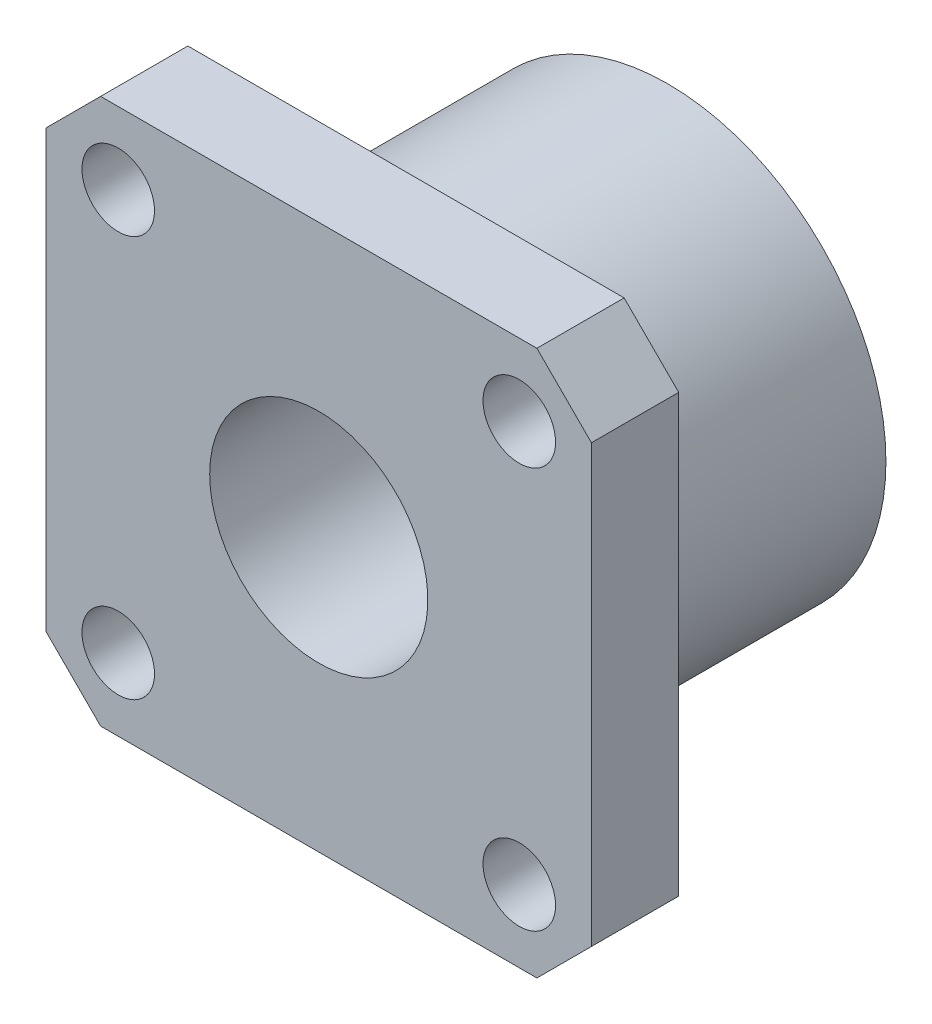
ISO-10303-21;
HEADER;
FILE_DESCRIPTION(('STEP AP214'),'2;1');
FILE_NAME('part.step','',(''),(''),'','','');
FILE_SCHEMA(('AUTOMOTIVE_DESIGN { 1 0 10303 214 1 1 1 1 }'));
ENDSEC;
DATA;
#1=APPLICATION_CONTEXT('core data for automotive mechanical design processes');
#2=APPLICATION_PROTOCOL_DEFINITION('international standard','automotive_design',2000,#1);
#3=PRODUCT_CONTEXT('',#1,'mechanical');
#4=PRODUCT('Part','Part','',(#3));
#5=PRODUCT_RELATED_PRODUCT_CATEGORY('part','',(#4));
#6=PRODUCT_DEFINITION_FORMATION('','',#4);
#7=PRODUCT_DEFINITION_CONTEXT('part definition',#1,'design');
#8=PRODUCT_DEFINITION('design','',#6,#7);
#9=PRODUCT_DEFINITION_SHAPE('','',#8);
#10=(LENGTH_UNIT() NAMED_UNIT(*) SI_UNIT(.MILLI.,.METRE.));
#11=(NAMED_UNIT(*) PLANE_ANGLE_UNIT() SI_UNIT($,.RADIAN.));
#12=(NAMED_UNIT(*) SI_UNIT($,.STERADIAN.) SOLID_ANGLE_UNIT());
#13=UNCERTAINTY_MEASURE_WITH_UNIT(LENGTH_MEASURE(1.E-05),#10,'distance_accuracy_value','');
#14=(GEOMETRIC_REPRESENTATION_CONTEXT(3) GLOBAL_UNCERTAINTY_ASSIGNED_CONTEXT((#13)) GLOBAL_UNIT_ASSIGNED_CONTEXT((#10,
#11,#12)) REPRESENTATION_CONTEXT('',''));
#15=CARTESIAN_POINT('',(0.,0.,0.));
#16=DIRECTION('',(0.,0.,1.));
#17=DIRECTION('',(1.,0.,0.));
#18=AXIS2_PLACEMENT_3D('',#15,#16,#17);
#19=CARTESIAN_POINT('',(0.,0.,8.));
#20=DIRECTION('',(0.,0.,1.));
#21=DIRECTION('',(1.,0.,0.));
#22=AXIS2_PLACEMENT_3D('',#19,#20,#21);
#23=PLANE('',#22);
#24=CARTESIAN_POINT('',(0.,0.,8.));
#25=DIRECTION('',(0.,0.,-1.));
#26=DIRECTION('',(-1.,0.,0.));
#27=AXIS2_PLACEMENT_3D('',#24,#25,#26);
#28=CIRCLE('',#27,10.);
#29=CARTESIAN_POINT('',(-10.,0.,8.));
#30=VERTEX_POINT('',#29);
#31=EDGE_CURVE('E373',#30,#30,#28,.T.);
#32=ORIENTED_EDGE('',*,*,#31,.T.);
#33=EDGE_LOOP('',(#32));
#34=FACE_BOUND('',#33,.T.);
#35=CARTESIAN_POINT('',(18.3847763108513,-18.3847763108492,8.));
#36=DIRECTION('',(0.,0.,1.));
#37=DIRECTION('',(1.,0.,0.));
#38=AXIS2_PLACEMENT_3D('',#35,#36,#37);
#39=CIRCLE('',#38,3.32500000000144);
#40=CARTESIAN_POINT('',(21.7097763108527,-18.3847763108492,8.));
#41=VERTEX_POINT('',#40);
#42=EDGE_CURVE('E203',#41,#41,#39,.T.);
#43=ORIENTED_EDGE('',*,*,#42,.F.);
#44=EDGE_LOOP('',(#43));
#45=FACE_BOUND('',#44,.T.);
#46=CARTESIAN_POINT('',(-18.3847763108502,18.3847763108502,8.));
#47=DIRECTION('',(0.,0.,1.));
#48=DIRECTION('',(1.,0.,0.));
#49=AXIS2_PLACEMENT_3D('',#46,#47,#48);
#50=CIRCLE('',#49,3.325);
#51=CARTESIAN_POINT('',(-15.0597763108502,18.3847763108502,8.));
#52=VERTEX_POINT('',#51);
#53=EDGE_CURVE('E141',#52,#52,#50,.T.);
#54=ORIENTED_EDGE('',*,*,#53,.F.);
#55=EDGE_LOOP('',(#54));
#56=FACE_BOUND('',#55,.T.);
#57=DIRECTION('',(0.,-1.,0.));
#58=VECTOR('',#57,1.);
#59=CARTESIAN_POINT('',(-25.,-25.,8.));
#60=LINE('',#59,#58);
#61=CARTESIAN_POINT('',(-25.,20.,8.));
#62=VERTEX_POINT('',#61);
#63=CARTESIAN_POINT('',(-25.,-20.,8.));
#64=VERTEX_POINT('',#63);
#65=EDGE_CURVE('E146',#62,#64,#60,.T.);
#66=ORIENTED_EDGE('',*,*,#65,.T.);
#67=DIRECTION('',(-0.707106781186546,0.707106781186549,0.));
#68=VECTOR('',#67,1.);
#69=CARTESIAN_POINT('',(-22.5000000000001,-22.4999999999999,8.));
#70=LINE('',#69,#68);
#71=CARTESIAN_POINT('',(-20.,-25.,8.));
#72=VERTEX_POINT('',#71);
#73=EDGE_CURVE('E161',#64,#72,#70,.F.);
#74=ORIENTED_EDGE('',*,*,#73,.T.);
#75=DIRECTION('',(1.,0.,0.));
#76=VECTOR('',#75,1.);
#77=CARTESIAN_POINT('',(25.,-25.,8.));
#78=LINE('',#77,#76);
#79=CARTESIAN_POINT('',(20.,-25.,8.));
#80=VERTEX_POINT('',#79);
#81=EDGE_CURVE('E128',#72,#80,#78,.T.);
#82=ORIENTED_EDGE('',*,*,#81,.T.);
#83=DIRECTION('',(-0.707106781186549,-0.707106781186546,0.));
#84=VECTOR('',#83,1.);
#85=CARTESIAN_POINT('',(22.4999999999999,-22.5,8.));
#86=LINE('',#85,#84);
#87=CARTESIAN_POINT('',(25.,-20.,8.));
#88=VERTEX_POINT('',#87);
#89=EDGE_CURVE('E159',#80,#88,#86,.F.);
#90=ORIENTED_EDGE('',*,*,#89,.T.);
#91=DIRECTION('',(0.,1.,0.));
#92=VECTOR('',#91,1.);
#93=CARTESIAN_POINT('',(25.,-25.,8.));
#94=LINE('',#93,#92);
#95=CARTESIAN_POINT('',(25.,20.,8.));
#96=VERTEX_POINT('',#95);
#97=EDGE_CURVE('E181',#88,#96,#94,.T.);
#98=ORIENTED_EDGE('',*,*,#97,.T.);
#99=DIRECTION('',(0.707106781186546,-0.707106781186549,0.));
#100=VECTOR('',#99,1.);
#101=CARTESIAN_POINT('',(22.5,22.5,8.));
#102=LINE('',#101,#100);
#103=CARTESIAN_POINT('',(20.,25.,8.));
#104=VERTEX_POINT('',#103);
#105=EDGE_CURVE('E63',#96,#104,#102,.F.);
#106=ORIENTED_EDGE('',*,*,#105,.T.);
#107=DIRECTION('',(-1.,0.,0.));
#108=VECTOR('',#107,1.);
#109=CARTESIAN_POINT('',(25.,25.,8.));
#110=LINE('',#109,#108);
#111=CARTESIAN_POINT('',(-20.,25.,8.));
#112=VERTEX_POINT('',#111);
#113=EDGE_CURVE('E147',#104,#112,#110,.T.);
#114=ORIENTED_EDGE('',*,*,#113,.T.);
#115=DIRECTION('',(0.707106781186549,0.707106781186546,0.));
#116=VECTOR('',#115,1.);
#117=CARTESIAN_POINT('',(-22.4999999999999,22.5000000000001,8.));
#118=LINE('',#117,#116);
#119=EDGE_CURVE('E156',#112,#62,#118,.F.);
#120=ORIENTED_EDGE('',*,*,#119,.T.);
#121=EDGE_LOOP('',(#66,#74,#82,#90,#98,#106,#114,#120));
#122=FACE_BOUND('',#121,.T.);
#123=CARTESIAN_POINT('',(18.3847763108502,18.3847763108513,8.));
#124=DIRECTION('',(0.,0.,1.));
#125=DIRECTION('',(1.,0.,0.));
#126=AXIS2_PLACEMENT_3D('',#123,#124,#125);
#127=CIRCLE('',#126,3.32500000000105);
#128=CARTESIAN_POINT('',(21.7097763108513,18.3847763108513,8.));
#129=VERTEX_POINT('',#128);
#130=EDGE_CURVE('E194',#129,#129,#127,.T.);
#131=ORIENTED_EDGE('',*,*,#130,.F.);
#132=EDGE_LOOP('',(#131));
#133=FACE_BOUND('',#132,.T.);
#134=CARTESIAN_POINT('',(-18.3847763108492,-18.3847763108503,8.));
#135=DIRECTION('',(0.,0.,1.));
#136=DIRECTION('',(1.,0.,0.));
#137=AXIS2_PLACEMENT_3D('',#134,#135,#136);
#138=CIRCLE('',#137,3.32500000000055);
#139=CARTESIAN_POINT('',(-15.0597763108487,-18.3847763108503,8.));
#140=VERTEX_POINT('',#139);
#141=EDGE_CURVE('E197',#140,#140,#138,.T.);
#142=ORIENTED_EDGE('',*,*,#141,.F.);
#143=EDGE_LOOP('',(#142));
#144=FACE_BOUND('',#143,.T.);
#145=ADVANCED_FACE('F40',(#34,#45,#56,#122,#133,#144),#23,.T.);
#146=CARTESIAN_POINT('',(0.,0.,0.));
#147=DIRECTION('',(0.,0.,1.));
#148=DIRECTION('',(1.,0.,0.));
#149=AXIS2_PLACEMENT_3D('',#146,#147,#148);
#150=PLANE('',#149);
#151=CARTESIAN_POINT('',(0.,0.,0.));
#152=DIRECTION('',(0.,0.,1.));
#153=DIRECTION('',(1.,0.,0.));
#154=AXIS2_PLACEMENT_3D('',#151,#152,#153);
#155=CIRCLE('',#154,20.);
#156=CARTESIAN_POINT('',(20.,0.,0.));
#157=VERTEX_POINT('',#156);
#158=EDGE_CURVE('E11',#157,#157,#155,.F.);
#159=ORIENTED_EDGE('',*,*,#158,.F.);
#160=EDGE_LOOP('',(#159));
#161=FACE_BOUND('',#160,.T.);
#162=DIRECTION('',(1.,0.,0.));
#163=VECTOR('',#162,1.);
#164=CARTESIAN_POINT('',(25.,-25.,0.));
#165=LINE('',#164,#163);
#166=CARTESIAN_POINT('',(-20.,-25.,0.));
#167=VERTEX_POINT('',#166);
#168=CARTESIAN_POINT('',(20.,-25.,0.));
#169=VERTEX_POINT('',#168);
#170=EDGE_CURVE('E125',#167,#169,#165,.T.);
#171=ORIENTED_EDGE('',*,*,#170,.F.);
#172=DIRECTION('',(0.707106781186546,-0.707106781186549,0.));
#173=VECTOR('',#172,1.);
#174=CARTESIAN_POINT('',(-20.,-25.,0.));
#175=LINE('',#174,#173);
#176=CARTESIAN_POINT('',(-25.,-20.,0.));
#177=VERTEX_POINT('',#176);
#178=EDGE_CURVE('E108',#167,#177,#175,.F.);
#179=ORIENTED_EDGE('',*,*,#178,.T.);
#180=DIRECTION('',(0.,-1.,0.));
#181=VECTOR('',#180,1.);
#182=CARTESIAN_POINT('',(-25.,-25.,0.));
#183=LINE('',#182,#181);
#184=CARTESIAN_POINT('',(-25.,20.,0.));
#185=VERTEX_POINT('',#184);
#186=EDGE_CURVE('E136',#185,#177,#183,.T.);
#187=ORIENTED_EDGE('',*,*,#186,.F.);
#188=DIRECTION('',(-0.707106781186549,-0.707106781186546,0.));
#189=VECTOR('',#188,1.);
#190=CARTESIAN_POINT('',(-25.,20.,0.));
#191=LINE('',#190,#189);
#192=CARTESIAN_POINT('',(-20.,25.,0.));
#193=VERTEX_POINT('',#192);
#194=EDGE_CURVE('E129',#185,#193,#191,.F.);
#195=ORIENTED_EDGE('',*,*,#194,.T.);
#196=DIRECTION('',(-1.,0.,0.));
#197=VECTOR('',#196,1.);
#198=CARTESIAN_POINT('',(25.,25.,0.));
#199=LINE('',#198,#197);
#200=CARTESIAN_POINT('',(20.,25.,0.));
#201=VERTEX_POINT('',#200);
#202=EDGE_CURVE('E139',#201,#193,#199,.T.);
#203=ORIENTED_EDGE('',*,*,#202,.F.);
#204=DIRECTION('',(-0.707106781186546,0.707106781186549,0.));
#205=VECTOR('',#204,1.);
#206=CARTESIAN_POINT('',(20.,25.,0.));
#207=LINE('',#206,#205);
#208=CARTESIAN_POINT('',(25.,20.,0.));
#209=VERTEX_POINT('',#208);
#210=EDGE_CURVE('E150',#201,#209,#207,.F.);
#211=ORIENTED_EDGE('',*,*,#210,.T.);
#212=DIRECTION('',(0.,1.,0.));
#213=VECTOR('',#212,1.);
#214=CARTESIAN_POINT('',(25.,-25.,0.));
#215=LINE('',#214,#213);
#216=CARTESIAN_POINT('',(25.,-20.,0.));
#217=VERTEX_POINT('',#216);
#218=EDGE_CURVE('E135',#217,#209,#215,.T.);
#219=ORIENTED_EDGE('',*,*,#218,.F.);
#220=DIRECTION('',(0.707106781186549,0.707106781186546,0.));
#221=VECTOR('',#220,1.);
#222=CARTESIAN_POINT('',(25.,-20.,0.));
#223=LINE('',#222,#221);
#224=EDGE_CURVE('E119',#217,#169,#223,.F.);
#225=ORIENTED_EDGE('',*,*,#224,.T.);
#226=EDGE_LOOP('',(#171,#179,#187,#195,#203,#211,#219,#225));
#227=FACE_BOUND('',#226,.T.);
#228=CARTESIAN_POINT('',(-18.3847763108502,18.3847763108502,0.));
#229=DIRECTION('',(0.,0.,1.));
#230=DIRECTION('',(1.,0.,0.));
#231=AXIS2_PLACEMENT_3D('',#228,#229,#230);
#232=CIRCLE('',#231,3.325);
#233=CARTESIAN_POINT('',(-15.0597763108502,18.3847763108502,0.));
#234=VERTEX_POINT('',#233);
#235=EDGE_CURVE('E184',#234,#234,#232,.T.);
#236=ORIENTED_EDGE('',*,*,#235,.T.);
#237=EDGE_LOOP('',(#236));
#238=FACE_BOUND('',#237,.T.);
#239=CARTESIAN_POINT('',(18.3847763108502,18.3847763108513,0.));
#240=DIRECTION('',(0.,0.,1.));
#241=DIRECTION('',(1.,0.,0.));
#242=AXIS2_PLACEMENT_3D('',#239,#240,#241);
#243=CIRCLE('',#242,3.32500000000105);
#244=CARTESIAN_POINT('',(21.7097763108513,18.3847763108513,0.));
#245=VERTEX_POINT('',#244);
#246=EDGE_CURVE('E212',#245,#245,#243,.T.);
#247=ORIENTED_EDGE('',*,*,#246,.T.);
#248=EDGE_LOOP('',(#247));
#249=FACE_BOUND('',#248,.T.);
#250=CARTESIAN_POINT('',(18.3847763108513,-18.3847763108492,0.));
#251=DIRECTION('',(0.,0.,1.));
#252=DIRECTION('',(1.,0.,0.));
#253=AXIS2_PLACEMENT_3D('',#250,#251,#252);
#254=CIRCLE('',#253,3.32500000000144);
#255=CARTESIAN_POINT('',(21.7097763108527,-18.3847763108492,0.));
#256=VERTEX_POINT('',#255);
#257=EDGE_CURVE('E199',#256,#256,#254,.T.);
#258=ORIENTED_EDGE('',*,*,#257,.T.);
#259=EDGE_LOOP('',(#258));
#260=FACE_BOUND('',#259,.T.);
#261=CARTESIAN_POINT('',(-18.3847763108492,-18.3847763108503,0.));
#262=DIRECTION('',(0.,0.,1.));
#263=DIRECTION('',(1.,0.,0.));
#264=AXIS2_PLACEMENT_3D('',#261,#262,#263);
#265=CIRCLE('',#264,3.32500000000055);
#266=CARTESIAN_POINT('',(-15.0597763108487,-18.3847763108503,0.));
#267=VERTEX_POINT('',#266);
#268=EDGE_CURVE('E200',#267,#267,#265,.T.);
#269=ORIENTED_EDGE('',*,*,#268,.T.);
#270=EDGE_LOOP('',(#269));
#271=FACE_BOUND('',#270,.T.);
#272=ADVANCED_FACE('F132',(#161,#227,#238,#249,#260,#271),#150,.F.);
#273=CARTESIAN_POINT('',(-25.,-25.,8.));
#274=DIRECTION('',(1.,0.,0.));
#275=DIRECTION('',(0.,0.,-1.));
#276=AXIS2_PLACEMENT_3D('',#273,#274,#275);
#277=PLANE('',#276);
#278=ORIENTED_EDGE('',*,*,#186,.T.);
#279=DIRECTION('',(0.,0.,1.));
#280=VECTOR('',#279,1.);
#281=CARTESIAN_POINT('',(-25.,-20.,8.));
#282=LINE('',#281,#280);
#283=EDGE_CURVE('E113',#177,#64,#282,.T.);
#284=ORIENTED_EDGE('',*,*,#283,.T.);
#285=ORIENTED_EDGE('',*,*,#65,.F.);
#286=DIRECTION('',(0.,0.,-1.));
#287=VECTOR('',#286,1.);
#288=CARTESIAN_POINT('',(-25.,20.,8.));
#289=LINE('',#288,#287);
#290=EDGE_CURVE('E118',#62,#185,#289,.T.);
#291=ORIENTED_EDGE('',*,*,#290,.T.);
#292=EDGE_LOOP('',(#278,#284,#285,#291));
#293=FACE_BOUND('',#292,.T.);
#294=ADVANCED_FACE('F178',(#293),#277,.F.);
#295=CARTESIAN_POINT('',(25.,-25.,8.));
#296=DIRECTION('',(0.,1.,0.));
#297=DIRECTION('',(-1.,0.,0.));
#298=AXIS2_PLACEMENT_3D('',#295,#296,#297);
#299=PLANE('',#298);
#300=ORIENTED_EDGE('',*,*,#81,.F.);
#301=DIRECTION('',(0.,0.,-1.));
#302=VECTOR('',#301,1.);
#303=CARTESIAN_POINT('',(-20.,-25.,8.));
#304=LINE('',#303,#302);
#305=EDGE_CURVE('E112',#72,#167,#304,.T.);
#306=ORIENTED_EDGE('',*,*,#305,.T.);
#307=ORIENTED_EDGE('',*,*,#170,.T.);
#308=DIRECTION('',(0.,0.,1.));
#309=VECTOR('',#308,1.);
#310=CARTESIAN_POINT('',(20.,-25.,8.));
#311=LINE('',#310,#309);
#312=EDGE_CURVE('E130',#169,#80,#311,.T.);
#313=ORIENTED_EDGE('',*,*,#312,.T.);
#314=EDGE_LOOP('',(#300,#306,#307,#313));
#315=FACE_BOUND('',#314,.T.);
#316=ADVANCED_FACE('F124',(#315),#299,.F.);
#317=CARTESIAN_POINT('',(25.,-25.,8.));
#318=DIRECTION('',(-1.,0.,0.));
#319=DIRECTION('',(0.,0.,1.));
#320=AXIS2_PLACEMENT_3D('',#317,#318,#319);
#321=PLANE('',#320);
#322=ORIENTED_EDGE('',*,*,#97,.F.);
#323=DIRECTION('',(0.,0.,-1.));
#324=VECTOR('',#323,1.);
#325=CARTESIAN_POINT('',(25.,-20.,8.));
#326=LINE('',#325,#324);
#327=EDGE_CURVE('E165',#88,#217,#326,.T.);
#328=ORIENTED_EDGE('',*,*,#327,.T.);
#329=ORIENTED_EDGE('',*,*,#218,.T.);
#330=DIRECTION('',(0.,0.,1.));
#331=VECTOR('',#330,1.);
#332=CARTESIAN_POINT('',(25.,20.,8.));
#333=LINE('',#332,#331);
#334=EDGE_CURVE('E163',#209,#96,#333,.T.);
#335=ORIENTED_EDGE('',*,*,#334,.T.);
#336=EDGE_LOOP('',(#322,#328,#329,#335));
#337=FACE_BOUND('',#336,.T.);
#338=ADVANCED_FACE('F234',(#337),#321,.F.);
#339=CARTESIAN_POINT('',(25.,25.,8.));
#340=DIRECTION('',(0.,-1.,0.));
#341=DIRECTION('',(1.,0.,0.));
#342=AXIS2_PLACEMENT_3D('',#339,#340,#341);
#343=PLANE('',#342);
#344=ORIENTED_EDGE('',*,*,#113,.F.);
#345=DIRECTION('',(0.,0.,-1.));
#346=VECTOR('',#345,1.);
#347=CARTESIAN_POINT('',(20.,25.,8.));
#348=LINE('',#347,#346);
#349=EDGE_CURVE('E49',#104,#201,#348,.T.);
#350=ORIENTED_EDGE('',*,*,#349,.T.);
#351=ORIENTED_EDGE('',*,*,#202,.T.);
#352=DIRECTION('',(0.,0.,1.));
#353=VECTOR('',#352,1.);
#354=CARTESIAN_POINT('',(-20.,25.,8.));
#355=LINE('',#354,#353);
#356=EDGE_CURVE('E56',#193,#112,#355,.T.);
#357=ORIENTED_EDGE('',*,*,#356,.T.);
#358=EDGE_LOOP('',(#344,#350,#351,#357));
#359=FACE_BOUND('',#358,.T.);
#360=ADVANCED_FACE('F171',(#359),#343,.F.);
#361=CARTESIAN_POINT('',(-18.3847763108502,18.3847763108502,8.));
#362=DIRECTION('',(0.,0.,-1.));
#363=DIRECTION('',(-1.,0.,0.));
#364=AXIS2_PLACEMENT_3D('',#361,#362,#363);
#365=CYLINDRICAL_SURFACE('',#364,3.325);
#366=ORIENTED_EDGE('',*,*,#53,.T.);
#367=EDGE_LOOP('',(#366));
#368=FACE_BOUND('',#367,.T.);
#369=ORIENTED_EDGE('',*,*,#235,.F.);
#370=EDGE_LOOP('',(#369));
#371=FACE_BOUND('',#370,.T.);
#372=ADVANCED_FACE('F223',(#368,#371),#365,.F.);
#373=CARTESIAN_POINT('',(18.3847763108502,18.3847763108513,8.));
#374=DIRECTION('',(0.,0.,-1.));
#375=DIRECTION('',(-1.,0.,0.));
#376=AXIS2_PLACEMENT_3D('',#373,#374,#375);
#377=CYLINDRICAL_SURFACE('',#376,3.32500000000105);
#378=ORIENTED_EDGE('',*,*,#130,.T.);
#379=EDGE_LOOP('',(#378));
#380=FACE_BOUND('',#379,.T.);
#381=ORIENTED_EDGE('',*,*,#246,.F.);
#382=EDGE_LOOP('',(#381));
#383=FACE_BOUND('',#382,.T.);
#384=ADVANCED_FACE('F225',(#380,#383),#377,.F.);
#385=CARTESIAN_POINT('',(18.3847763108513,-18.3847763108492,8.));
#386=DIRECTION('',(0.,0.,-1.));
#387=DIRECTION('',(-1.,0.,0.));
#388=AXIS2_PLACEMENT_3D('',#385,#386,#387);
#389=CYLINDRICAL_SURFACE('',#388,3.32500000000144);
#390=ORIENTED_EDGE('',*,*,#42,.T.);
#391=EDGE_LOOP('',(#390));
#392=FACE_BOUND('',#391,.T.);
#393=ORIENTED_EDGE('',*,*,#257,.F.);
#394=EDGE_LOOP('',(#393));
#395=FACE_BOUND('',#394,.T.);
#396=ADVANCED_FACE('F231',(#392,#395),#389,.F.);
#397=CARTESIAN_POINT('',(-18.3847763108492,-18.3847763108503,8.));
#398=DIRECTION('',(0.,0.,-1.));
#399=DIRECTION('',(-1.,0.,0.));
#400=AXIS2_PLACEMENT_3D('',#397,#398,#399);
#401=CYLINDRICAL_SURFACE('',#400,3.32500000000055);
#402=ORIENTED_EDGE('',*,*,#141,.T.);
#403=EDGE_LOOP('',(#402));
#404=FACE_BOUND('',#403,.T.);
#405=ORIENTED_EDGE('',*,*,#268,.F.);
#406=EDGE_LOOP('',(#405));
#407=FACE_BOUND('',#406,.T.);
#408=ADVANCED_FACE('F255',(#404,#407),#401,.F.);
#409=CARTESIAN_POINT('',(-20.,-25.,8.));
#410=DIRECTION('',(0.707106781186549,0.707106781186546,0.));
#411=DIRECTION('',(0.,0.,-1.));
#412=AXIS2_PLACEMENT_3D('',#409,#410,#411);
#413=PLANE('',#412);
#414=ORIENTED_EDGE('',*,*,#73,.F.);
#415=ORIENTED_EDGE('',*,*,#283,.F.);
#416=ORIENTED_EDGE('',*,*,#178,.F.);
#417=ORIENTED_EDGE('',*,*,#305,.F.);
#418=EDGE_LOOP('',(#414,#415,#416,#417));
#419=FACE_BOUND('',#418,.T.);
#420=ADVANCED_FACE('F111',(#419),#413,.F.);
#421=CARTESIAN_POINT('',(25.,-20.,8.));
#422=DIRECTION('',(-0.707106781186546,0.707106781186549,0.));
#423=DIRECTION('',(0.,0.,-1.));
#424=AXIS2_PLACEMENT_3D('',#421,#422,#423);
#425=PLANE('',#424);
#426=ORIENTED_EDGE('',*,*,#89,.F.);
#427=ORIENTED_EDGE('',*,*,#312,.F.);
#428=ORIENTED_EDGE('',*,*,#224,.F.);
#429=ORIENTED_EDGE('',*,*,#327,.F.);
#430=EDGE_LOOP('',(#426,#427,#428,#429));
#431=FACE_BOUND('',#430,.T.);
#432=ADVANCED_FACE('F254',(#431),#425,.F.);
#433=CARTESIAN_POINT('',(20.,25.,8.));
#434=DIRECTION('',(-0.707106781186549,-0.707106781186546,0.));
#435=DIRECTION('',(0.,0.,-1.));
#436=AXIS2_PLACEMENT_3D('',#433,#434,#435);
#437=PLANE('',#436);
#438=ORIENTED_EDGE('',*,*,#105,.F.);
#439=ORIENTED_EDGE('',*,*,#334,.F.);
#440=ORIENTED_EDGE('',*,*,#210,.F.);
#441=ORIENTED_EDGE('',*,*,#349,.F.);
#442=EDGE_LOOP('',(#438,#439,#440,#441));
#443=FACE_BOUND('',#442,.T.);
#444=ADVANCED_FACE('F260',(#443),#437,.F.);
#445=CARTESIAN_POINT('',(-25.,20.,8.));
#446=DIRECTION('',(0.707106781186546,-0.707106781186549,0.));
#447=DIRECTION('',(0.,0.,-1.));
#448=AXIS2_PLACEMENT_3D('',#445,#446,#447);
#449=PLANE('',#448);
#450=ORIENTED_EDGE('',*,*,#119,.F.);
#451=ORIENTED_EDGE('',*,*,#356,.F.);
#452=ORIENTED_EDGE('',*,*,#194,.F.);
#453=ORIENTED_EDGE('',*,*,#290,.F.);
#454=EDGE_LOOP('',(#450,#451,#452,#453));
#455=FACE_BOUND('',#454,.T.);
#456=ADVANCED_FACE('F43',(#455),#449,.F.);
#457=CARTESIAN_POINT('',(0.,0.,-24.));
#458=DIRECTION('',(0.,0.,-1.));
#459=DIRECTION('',(-1.,0.,0.));
#460=AXIS2_PLACEMENT_3D('',#457,#458,#459);
#461=PLANE('',#460);
#462=CARTESIAN_POINT('',(0.,0.,-24.));
#463=DIRECTION('',(0.,0.,-1.));
#464=DIRECTION('',(-1.,0.,0.));
#465=AXIS2_PLACEMENT_3D('',#462,#463,#464);
#466=CIRCLE('',#465,20.);
#467=CARTESIAN_POINT('',(-20.,0.,-24.));
#468=VERTEX_POINT('',#467);
#469=EDGE_CURVE('E206',#468,#468,#466,.T.);
#470=ORIENTED_EDGE('',*,*,#469,.T.);
#471=EDGE_LOOP('',(#470));
#472=FACE_BOUND('',#471,.T.);
#473=CARTESIAN_POINT('',(0.,0.,-24.));
#474=DIRECTION('',(0.,0.,-1.));
#475=DIRECTION('',(-1.,0.,0.));
#476=AXIS2_PLACEMENT_3D('',#473,#474,#475);
#477=CIRCLE('',#476,10.);
#478=CARTESIAN_POINT('',(-10.,0.,-24.));
#479=VERTEX_POINT('',#478);
#480=EDGE_CURVE('E370',#479,#479,#477,.T.);
#481=ORIENTED_EDGE('',*,*,#480,.F.);
#482=EDGE_LOOP('',(#481));
#483=FACE_BOUND('',#482,.T.);
#484=ADVANCED_FACE('F268',(#472,#483),#461,.T.);
#485=CARTESIAN_POINT('',(0.,0.,-24.));
#486=DIRECTION('',(0.,0.,1.));
#487=DIRECTION('',(1.,0.,0.));
#488=AXIS2_PLACEMENT_3D('',#485,#486,#487);
#489=CYLINDRICAL_SURFACE('',#488,20.);
#490=ORIENTED_EDGE('',*,*,#469,.F.);
#491=EDGE_LOOP('',(#490));
#492=FACE_BOUND('',#491,.T.);
#493=ORIENTED_EDGE('',*,*,#158,.T.);
#494=EDGE_LOOP('',(#493));
#495=FACE_BOUND('',#494,.T.);
#496=ADVANCED_FACE('F276',(#492,#495),#489,.T.);
#497=CARTESIAN_POINT('',(0.,0.,-24.));
#498=DIRECTION('',(0.,0.,1.));
#499=DIRECTION('',(1.,0.,0.));
#500=AXIS2_PLACEMENT_3D('',#497,#498,#499);
#501=CYLINDRICAL_SURFACE('',#500,10.);
#502=ORIENTED_EDGE('',*,*,#480,.T.);
#503=EDGE_LOOP('',(#502));
#504=FACE_BOUND('',#503,.T.);
#505=ORIENTED_EDGE('',*,*,#31,.F.);
#506=EDGE_LOOP('',(#505));
#507=FACE_BOUND('',#506,.T.);
#508=ADVANCED_FACE('F282',(#504,#507),#501,.F.);
#509=CLOSED_SHELL('',(#145,#272,#294,#316,#338,#360,#372,#384,#396,#408,#420,#432,#444,#456,
#484,#496,#508));
#510=MANIFOLD_SOLID_BREP('B2',#509);
#511=ADVANCED_BREP_SHAPE_REPRESENTATION('',(#18,#510),#14);
#512=SHAPE_DEFINITION_REPRESENTATION(#9,#511);
ENDSEC;
END-ISO-10303-21;
